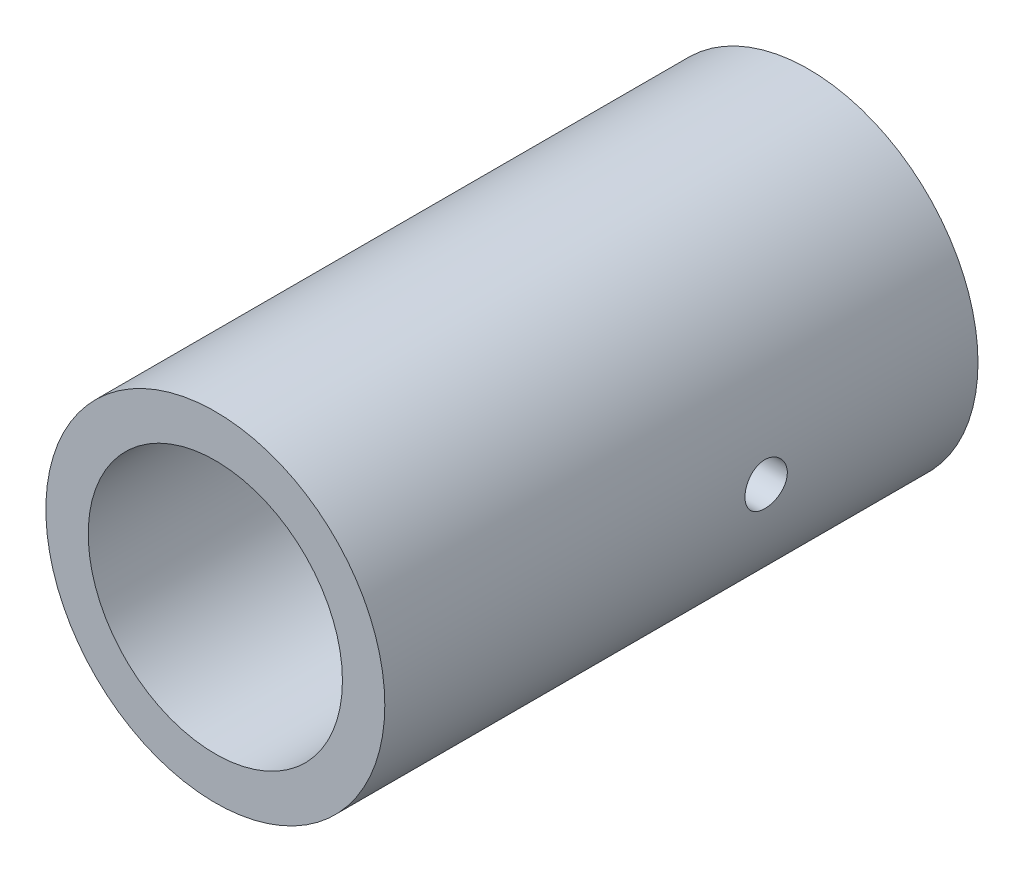
ISO-10303-21;
HEADER;
FILE_DESCRIPTION(('STEP AP214'),'2;1');
FILE_NAME('part.step','',(''),(''),'','','');
FILE_SCHEMA(('AUTOMOTIVE_DESIGN { 1 0 10303 214 1 1 1 1 }'));
ENDSEC;
DATA;
#1=APPLICATION_CONTEXT('core data for automotive mechanical design processes');
#2=APPLICATION_PROTOCOL_DEFINITION('international standard','automotive_design',2000,#1);
#3=PRODUCT_CONTEXT('',#1,'mechanical');
#4=PRODUCT('Part','Part','',(#3));
#5=PRODUCT_RELATED_PRODUCT_CATEGORY('part','',(#4));
#6=PRODUCT_DEFINITION_FORMATION('','',#4);
#7=PRODUCT_DEFINITION_CONTEXT('part definition',#1,'design');
#8=PRODUCT_DEFINITION('design','',#6,#7);
#9=PRODUCT_DEFINITION_SHAPE('','',#8);
#10=(LENGTH_UNIT() NAMED_UNIT(*) SI_UNIT(.MILLI.,.METRE.));
#11=(NAMED_UNIT(*) PLANE_ANGLE_UNIT() SI_UNIT($,.RADIAN.));
#12=(NAMED_UNIT(*) SI_UNIT($,.STERADIAN.) SOLID_ANGLE_UNIT());
#13=UNCERTAINTY_MEASURE_WITH_UNIT(LENGTH_MEASURE(1.E-05),#10,'distance_accuracy_value','');
#14=(GEOMETRIC_REPRESENTATION_CONTEXT(3) GLOBAL_UNCERTAINTY_ASSIGNED_CONTEXT((#13)) GLOBAL_UNIT_ASSIGNED_CONTEXT((#10,
#11,#12)) REPRESENTATION_CONTEXT('',''));
#15=CARTESIAN_POINT('',(0.,0.,0.));
#16=DIRECTION('',(0.,0.,1.));
#17=DIRECTION('',(1.,0.,0.));
#18=AXIS2_PLACEMENT_3D('',#15,#16,#17);
#19=CARTESIAN_POINT('',(0.,0.,70.));
#20=DIRECTION('',(0.,0.,-1.));
#21=DIRECTION('',(-1.,0.,0.));
#22=AXIS2_PLACEMENT_3D('',#19,#20,#21);
#23=CYLINDRICAL_SURFACE('',#22,20.);
#24=CARTESIAN_POINT('',(-20.,0.,27.5));
#25=CARTESIAN_POINT('',(-19.9999980489643,-0.139841095555761,27.4999940590643));
#26=CARTESIAN_POINT('',(-19.998517845549,-0.279769574302747,27.4882271208307));
#27=CARTESIAN_POINT('',(-19.9927554011136,-0.555732802089752,27.4414722454292));
#28=CARTESIAN_POINT('',(-19.9884702344143,-0.691763330623744,27.4064600620766));
#29=CARTESIAN_POINT('',(-19.9775806104441,-0.955895574813054,27.3142623560859));
#30=CARTESIAN_POINT('',(-19.9709777145554,-1.08400256014614,27.2570917581901));
#31=CARTESIAN_POINT('',(-19.956187008781,-1.32877947489304,27.1222327160302));
#32=CARTESIAN_POINT('',(-19.9479994708412,-1.44545136155637,27.0445477914693));
#33=CARTESIAN_POINT('',(-19.9309032130633,-1.66471281693132,26.8704080501604));
#34=CARTESIAN_POINT('',(-19.9219911469242,-1.76723036493713,26.7738628706538));
#35=CARTESIAN_POINT('',(-19.9044772600975,-1.95465279355749,26.5649371764634));
#36=CARTESIAN_POINT('',(-19.8958754552427,-2.03955677639225,26.4525558550868));
#37=CARTESIAN_POINT('',(-19.8799230561958,-2.18961016128394,26.2146800224343));
#38=CARTESIAN_POINT('',(-19.8725767717791,-2.25469209594107,26.0891426384321));
#39=CARTESIAN_POINT('',(-19.8600112845768,-2.36282307657512,25.8288129480527));
#40=CARTESIAN_POINT('',(-19.8547920011314,-2.40587295806522,25.694020992853));
#41=CARTESIAN_POINT('',(-19.8471033960361,-2.46849898002476,25.4197558044132));
#42=CARTESIAN_POINT('',(-19.8446198343674,-2.4881967147317,25.2803107422958));
#43=CARTESIAN_POINT('',(-19.8426402814279,-2.50393554955723,25.0000737365282));
#44=CARTESIAN_POINT('',(-19.8431441700151,-2.49997760100242,24.8592818472687));
#45=CARTESIAN_POINT('',(-19.8470695536975,-2.46861723644791,24.5811951727512));
#46=CARTESIAN_POINT('',(-19.8504743796033,-2.4413487629847,24.4438850137997));
#47=CARTESIAN_POINT('',(-19.8597919975763,-2.36435038318205,24.175804978781));
#48=CARTESIAN_POINT('',(-19.8657048404572,-2.31462002175191,24.045035235286));
#49=CARTESIAN_POINT('',(-19.8793911586465,-2.19396555991165,23.7933320009783));
#50=CARTESIAN_POINT('',(-19.8871697321144,-2.12298325370764,23.672426699751));
#51=CARTESIAN_POINT('',(-19.903707114306,-1.96188146945692,23.4441933055868));
#52=CARTESIAN_POINT('',(-19.9124659678566,-1.87176111608078,23.3368658340263));
#53=CARTESIAN_POINT('',(-19.9300510989042,-1.67419911075378,23.1380572892773));
#54=CARTESIAN_POINT('',(-19.9388774238689,-1.56664200784002,23.046690908234));
#55=CARTESIAN_POINT('',(-19.9555463255585,-1.33765716911393,22.8832911199695));
#56=CARTESIAN_POINT('',(-19.9633889000151,-1.21622940131826,22.811257757328));
#57=CARTESIAN_POINT('',(-19.9772115221858,-0.962861671363486,22.6885686795361));
#58=CARTESIAN_POINT('',(-19.9831909440154,-0.830918195337722,22.6379201461188));
#59=CARTESIAN_POINT('',(-19.9926078578006,-0.560307940431063,22.5595295064767));
#60=CARTESIAN_POINT('',(-19.9960454687587,-0.421641476630674,22.531786327863));
#61=CARTESIAN_POINT('',(-19.9999759641076,-0.142513163913505,22.5001425757394));
#62=CARTESIAN_POINT('',(-20.0004883614264,-0.00206949019861401,22.4960840076359));
#63=CARTESIAN_POINT('',(-19.9985633800543,0.277496036497489,22.511507734056));
#64=CARTESIAN_POINT('',(-19.9961260641821,0.416617917564699,22.5309895272516));
#65=CARTESIAN_POINT('',(-19.9885876875669,0.689124507721515,22.5928097087744));
#66=CARTESIAN_POINT('',(-19.9834954081387,0.822526570424698,22.6350727634026));
#67=CARTESIAN_POINT('',(-19.971217231002,1.0803496548584,22.7411774519129));
#68=CARTESIAN_POINT('',(-19.9640312622062,1.20477037146531,22.8050198184914));
#69=CARTESIAN_POINT('',(-19.9483182291011,1.44180452068742,22.9528531375075));
#70=CARTESIAN_POINT('',(-19.9397844404251,1.55435375994381,23.0369462898056));
#71=CARTESIAN_POINT('',(-19.9223514232566,1.76379698962631,23.2227494975342));
#72=CARTESIAN_POINT('',(-19.913452180269,1.86069035833685,23.324460252251));
#73=CARTESIAN_POINT('',(-19.8962310546258,2.03663195881801,23.5433074167571));
#74=CARTESIAN_POINT('',(-19.8879127472133,2.11557546056793,23.6605283463104));
#75=CARTESIAN_POINT('',(-19.8728541103715,2.2526528894435,23.9066582448547));
#76=CARTESIAN_POINT('',(-19.8661137493103,2.31078723372836,24.0355669794765));
#77=CARTESIAN_POINT('',(-19.8549985039299,2.40442657886653,24.3010753191476));
#78=CARTESIAN_POINT('',(-19.8506174518479,2.4399906274571,24.437653830048));
#79=CARTESIAN_POINT('',(-19.8446991590745,2.48766999386784,24.7149024837807));
#80=CARTESIAN_POINT('',(-19.8431617860878,2.49978640253576,24.855572435959));
#81=CARTESIAN_POINT('',(-19.8431087698246,2.50020653608483,25.1359689292047));
#82=CARTESIAN_POINT('',(-19.8445722475195,2.48867479769927,25.2756952483319));
#83=CARTESIAN_POINT('',(-19.850311145372,2.44247440484932,25.5512071293451));
#84=CARTESIAN_POINT('',(-19.8545865658308,2.40780574790577,25.6869926908088));
#85=CARTESIAN_POINT('',(-19.8654611577455,2.31636707368965,25.9507469567664));
#86=CARTESIAN_POINT('',(-19.8720594959278,2.25960498097093,26.0787184450218));
#87=CARTESIAN_POINT('',(-19.8868378324482,2.12560690215031,26.3233466540483));
#88=CARTESIAN_POINT('',(-19.8950178506041,2.04837065950959,26.4400032330198));
#89=CARTESIAN_POINT('',(-19.9121060475223,1.87500633126584,26.6595312253405));
#90=CARTESIAN_POINT('',(-19.9210187208403,1.77875562577496,26.762305460955));
#91=CARTESIAN_POINT('',(-19.938528315929,1.57035022696838,26.950306825168));
#92=CARTESIAN_POINT('',(-19.9471251627559,1.45819178914157,27.0355298107743));
#93=CARTESIAN_POINT('',(-19.9630705658675,1.22066562085421,27.1862853571053));
#94=CARTESIAN_POINT('',(-19.970414250783,1.09524927959617,27.2517418058993));
#95=CARTESIAN_POINT('',(-19.9829764907672,0.835182902301281,27.3605712429163));
#96=CARTESIAN_POINT('',(-19.9881973536958,0.700543080870237,27.4039682263535));
#97=CARTESIAN_POINT('',(-19.9946672032775,0.471005771967925,27.4570593381713));
#98=CARTESIAN_POINT('',(-19.9966572589545,0.377555663516921,27.4731389419821));
#99=CARTESIAN_POINT('',(-19.9993243132919,0.189417063212435,27.4946112456932));
#100=CARTESIAN_POINT('',(-20.0000013216347,0.0947285804960274,27.5000040243993));
#101=CARTESIAN_POINT('',(-20.,0.,27.5));
#102=B_SPLINE_CURVE_WITH_KNOTS('',3,(#24,#25,#26,#27,#28,#29,#30,#31,#32,#33,#34,#35,#36,#37,
#38,#39,#40,#41,#42,#43,#44,#45,#46,#47,#48,#49,#50,#51,#52,#53,#54,#55,#56,#57,#58,#59,#60,#61,
#62,#63,#64,#65,#66,#67,#68,#69,#70,#71,#72,#73,#74,#75,#76,#77,#78,#79,#80,#81,#82,#83,#84,#85,
#86,#87,#88,#89,#90,#91,#92,#93,#94,#95,#96,#97,#98,#99,#100,#101),.UNSPECIFIED.,.T.,.F.,(4,2,2,
2,2,2,2,2,2,2,2,2,2,2,2,2,2,2,2,2,2,2,2,2,2,2,2,2,2,2,2,2,2,2,2,2,2,2,4),(0.,0.419177272776247,
0.838792460943426,1.25812550818177,1.67738665591073,2.09870813201843,2.5200510780001,
2.94281250318869,3.36555789496806,3.78609225286321,4.20660969884664,4.62472696441692,
5.04285270166241,5.46213426285533,5.88143500513638,6.30363478136417,6.72583553113113,
7.14817795731605,7.5705006090378,7.99000279391921,8.40949604501928,8.82761053893396,
9.24573923078947,9.66602402928422,10.0863255137509,10.5090197150757,10.9317054422154,
11.3532807428092,11.7748364301062,12.1934690120221,12.6121016387955,13.0305842470649,
13.4490720991226,13.8703523769183,14.2917319847001,14.7147140303685,15.1372349868403,
15.4211884318763,15.7051397830044),.UNSPECIFIED.);
#103=CARTESIAN_POINT('',(-20.,0.,27.5));
#104=VERTEX_POINT('',#103);
#105=EDGE_CURVE('E70',#104,#104,#102,.T.);
#106=ORIENTED_EDGE('',*,*,#105,.T.);
#107=EDGE_LOOP('',(#106));
#108=FACE_BOUND('',#107,.T.);
#109=CARTESIAN_POINT('',(20.,0.,22.5));
#110=CARTESIAN_POINT('',(19.9999980489643,-0.139841095555761,22.5000059409357));
#111=CARTESIAN_POINT('',(19.998517845549,-0.279769574302747,22.5117728791693));
#112=CARTESIAN_POINT('',(19.9927554011136,-0.555732802089752,22.5585277545708));
#113=CARTESIAN_POINT('',(19.9884702344143,-0.691763330623744,22.5935399379234));
#114=CARTESIAN_POINT('',(19.9775806104441,-0.955895574813053,22.6857376439141));
#115=CARTESIAN_POINT('',(19.9709777145554,-1.08400256014614,22.7429082418099));
#116=CARTESIAN_POINT('',(19.956187008781,-1.32877947489303,22.8777672839698));
#117=CARTESIAN_POINT('',(19.9479994708412,-1.44545136155637,22.9554522085307));
#118=CARTESIAN_POINT('',(19.9309032130633,-1.66471281693131,23.1295919498396));
#119=CARTESIAN_POINT('',(19.9219911469242,-1.76723036493713,23.2261371293462));
#120=CARTESIAN_POINT('',(19.9044772600975,-1.95465279355749,23.4350628235366));
#121=CARTESIAN_POINT('',(19.8958754552427,-2.03955677639225,23.5474441449132));
#122=CARTESIAN_POINT('',(19.8799230561958,-2.18961016128394,23.7853199775657));
#123=CARTESIAN_POINT('',(19.8725767717791,-2.25469209594107,23.9108573615679));
#124=CARTESIAN_POINT('',(19.8600112845768,-2.36282307657512,24.1711870519474));
#125=CARTESIAN_POINT('',(19.8547920011314,-2.40587295806522,24.305979007147));
#126=CARTESIAN_POINT('',(19.8471033960361,-2.46849898002476,24.5802441955868));
#127=CARTESIAN_POINT('',(19.8446198343674,-2.4881967147317,24.7196892577042));
#128=CARTESIAN_POINT('',(19.8426402814279,-2.50393554955723,24.9999262634718));
#129=CARTESIAN_POINT('',(19.8431441700151,-2.49997760100242,25.1407181527313));
#130=CARTESIAN_POINT('',(19.8470695536975,-2.46861723644791,25.4188048272488));
#131=CARTESIAN_POINT('',(19.8504743796033,-2.4413487629847,25.5561149862003));
#132=CARTESIAN_POINT('',(19.8597919975763,-2.36435038318205,25.824195021219));
#133=CARTESIAN_POINT('',(19.8657048404572,-2.31462002175191,25.954964764714));
#134=CARTESIAN_POINT('',(19.8793911586465,-2.19396555991165,26.2066679990217));
#135=CARTESIAN_POINT('',(19.8871697321144,-2.12298325370764,26.327573300249));
#136=CARTESIAN_POINT('',(19.903707114306,-1.96188146945692,26.5558066944132));
#137=CARTESIAN_POINT('',(19.9124659678566,-1.87176111608078,26.6631341659737));
#138=CARTESIAN_POINT('',(19.9300510989042,-1.67419911075378,26.8619427107227));
#139=CARTESIAN_POINT('',(19.9388774238689,-1.56664200784002,26.953309091766));
#140=CARTESIAN_POINT('',(19.9555463255585,-1.33765716911393,27.1167088800305));
#141=CARTESIAN_POINT('',(19.963388900015,-1.21622940131826,27.188742242672));
#142=CARTESIAN_POINT('',(19.9772115221858,-0.96286167136349,27.3114313204639));
#143=CARTESIAN_POINT('',(19.9831909440154,-0.830918195337726,27.3620798538812));
#144=CARTESIAN_POINT('',(19.9926078578006,-0.560307940431066,27.4404704935233));
#145=CARTESIAN_POINT('',(19.9960454687587,-0.421641476630676,27.4682136721371));
#146=CARTESIAN_POINT('',(19.9999759641076,-0.142513163913506,27.4998574242606));
#147=CARTESIAN_POINT('',(20.0004883614264,-0.0020694901986158,27.5039159923641));
#148=CARTESIAN_POINT('',(19.9985633800543,0.277496036497488,27.488492265944));
#149=CARTESIAN_POINT('',(19.9961260641821,0.416617917564699,27.4690104727484));
#150=CARTESIAN_POINT('',(19.9885876875669,0.689124507721515,27.4071902912256));
#151=CARTESIAN_POINT('',(19.9834954081387,0.822526570424698,27.3649272365974));
#152=CARTESIAN_POINT('',(19.971217231002,1.0803496548584,27.2588225480871));
#153=CARTESIAN_POINT('',(19.9640312622062,1.20477037146531,27.1949801815086));
#154=CARTESIAN_POINT('',(19.9483182291011,1.44180452068742,27.0471468624925));
#155=CARTESIAN_POINT('',(19.9397844404251,1.55435375994381,26.9630537101944));
#156=CARTESIAN_POINT('',(19.9223514232566,1.76379698962631,26.7772505024658));
#157=CARTESIAN_POINT('',(19.913452180269,1.86069035833685,26.675539747749));
#158=CARTESIAN_POINT('',(19.8962310546258,2.03663195881801,26.4566925832429));
#159=CARTESIAN_POINT('',(19.8879127472133,2.11557546056793,26.3394716536896));
#160=CARTESIAN_POINT('',(19.8728541103715,2.2526528894435,26.0933417551453));
#161=CARTESIAN_POINT('',(19.8661137493103,2.31078723372836,25.9644330205235));
#162=CARTESIAN_POINT('',(19.8549985039299,2.40442657886653,25.6989246808524));
#163=CARTESIAN_POINT('',(19.8506174518479,2.4399906274571,25.562346169952));
#164=CARTESIAN_POINT('',(19.8446991590745,2.48766999386784,25.2850975162193));
#165=CARTESIAN_POINT('',(19.8431617860878,2.49978640253576,25.144427564041));
#166=CARTESIAN_POINT('',(19.8431087698246,2.50020653608483,24.8640310707953));
#167=CARTESIAN_POINT('',(19.8445722475195,2.48867479769927,24.7243047516681));
#168=CARTESIAN_POINT('',(19.850311145372,2.44247440484932,24.4487928706549));
#169=CARTESIAN_POINT('',(19.8545865658308,2.40780574790577,24.3130073091912));
#170=CARTESIAN_POINT('',(19.8654611577455,2.31636707368965,24.0492530432336));
#171=CARTESIAN_POINT('',(19.8720594959278,2.25960498097093,23.9212815549782));
#172=CARTESIAN_POINT('',(19.8868378324482,2.12560690215031,23.6766533459517));
#173=CARTESIAN_POINT('',(19.8950178506041,2.04837065950959,23.5599967669802));
#174=CARTESIAN_POINT('',(19.9121060475223,1.87500633126584,23.3404687746595));
#175=CARTESIAN_POINT('',(19.9210187208403,1.77875562577496,23.237694539045));
#176=CARTESIAN_POINT('',(19.938528315929,1.57035022696838,23.049693174832));
#177=CARTESIAN_POINT('',(19.9471251627559,1.45819178914157,22.9644701892257));
#178=CARTESIAN_POINT('',(19.9630705658675,1.22066562085421,22.8137146428947));
#179=CARTESIAN_POINT('',(19.970414250783,1.09524927959617,22.7482581941007));
#180=CARTESIAN_POINT('',(19.9829764907672,0.835182902301281,22.6394287570837));
#181=CARTESIAN_POINT('',(19.9881973536958,0.700543080870237,22.5960317736465));
#182=CARTESIAN_POINT('',(19.9946672032775,0.471005771967926,22.5429406618287));
#183=CARTESIAN_POINT('',(19.9966572589545,0.377555663516922,22.5268610580179));
#184=CARTESIAN_POINT('',(19.9993243132919,0.189417063212436,22.5053887543068));
#185=CARTESIAN_POINT('',(20.0000013216347,0.0947285804960277,22.4999959756007));
#186=CARTESIAN_POINT('',(20.,0.,22.5));
#187=B_SPLINE_CURVE_WITH_KNOTS('',3,(#109,#110,#111,#112,#113,#114,#115,#116,#117,#118,#119,
#120,#121,#122,#123,#124,#125,#126,#127,#128,#129,#130,#131,#132,#133,#134,#135,#136,#137,#138,
#139,#140,#141,#142,#143,#144,#145,#146,#147,#148,#149,#150,#151,#152,#153,#154,#155,#156,#157,
#158,#159,#160,#161,#162,#163,#164,#165,#166,#167,#168,#169,#170,#171,#172,#173,#174,#175,#176,
#177,#178,#179,#180,#181,#182,#183,#184,#185,#186),.UNSPECIFIED.,.T.,.F.,(4,2,2,2,2,2,2,2,2,2,2,
2,2,2,2,2,2,2,2,2,2,2,2,2,2,2,2,2,2,2,2,2,2,2,2,2,2,2,4),(0.,0.419177272776247,
0.838792460943426,1.25812550818177,1.67738665591073,2.09870813201843,2.5200510780001,
2.94281250318869,3.36555789496806,3.7860922528632,4.20660969884664,4.62472696441692,
5.04285270166241,5.46213426285533,5.88143500513638,6.30363478136416,6.72583553113113,
7.14817795731604,7.5705006090378,7.99000279391921,8.40949604501928,8.82761053893396,
9.24573923078947,9.66602402928421,10.0863255137509,10.5090197150757,10.9317054422154,
11.3532807428092,11.7748364301062,12.1934690120221,12.6121016387955,13.0305842470649,
13.4490720991226,13.8703523769183,14.2917319847001,14.7147140303685,15.1372349868403,
15.4211884318763,15.7051397830044),.UNSPECIFIED.);
#188=CARTESIAN_POINT('',(20.,0.,22.5));
#189=VERTEX_POINT('',#188);
#190=EDGE_CURVE('E74',#189,#189,#187,.T.);
#191=ORIENTED_EDGE('',*,*,#190,.T.);
#192=EDGE_LOOP('',(#191));
#193=FACE_BOUND('',#192,.T.);
#194=CARTESIAN_POINT('',(0.,0.,70.));
#195=DIRECTION('',(0.,0.,1.));
#196=DIRECTION('',(1.,0.,0.));
#197=AXIS2_PLACEMENT_3D('',#194,#195,#196);
#198=CIRCLE('',#197,20.);
#199=CARTESIAN_POINT('',(20.,0.,70.));
#200=VERTEX_POINT('',#199);
#201=EDGE_CURVE('E10',#200,#200,#198,.T.);
#202=ORIENTED_EDGE('',*,*,#201,.F.);
#203=EDGE_LOOP('',(#202));
#204=FACE_BOUND('',#203,.T.);
#205=CARTESIAN_POINT('',(0.,0.,0.));
#206=DIRECTION('',(0.,0.,1.));
#207=DIRECTION('',(1.,0.,0.));
#208=AXIS2_PLACEMENT_3D('',#205,#206,#207);
#209=CIRCLE('',#208,20.);
#210=CARTESIAN_POINT('',(20.,0.,0.));
#211=VERTEX_POINT('',#210);
#212=EDGE_CURVE('E43',#211,#211,#209,.T.);
#213=ORIENTED_EDGE('',*,*,#212,.T.);
#214=EDGE_LOOP('',(#213));
#215=FACE_BOUND('',#214,.T.);
#216=ADVANCED_FACE('F31',(#108,#193,#204,#215),#23,.T.);
#217=CARTESIAN_POINT('',(0.,0.,70.));
#218=DIRECTION('',(0.,0.,1.));
#219=DIRECTION('',(1.,0.,0.));
#220=AXIS2_PLACEMENT_3D('',#217,#218,#219);
#221=PLANE('',#220);
#222=CARTESIAN_POINT('',(0.,0.,70.));
#223=DIRECTION('',(0.,0.,1.));
#224=DIRECTION('',(1.,0.,0.));
#225=AXIS2_PLACEMENT_3D('',#222,#223,#224);
#226=CIRCLE('',#225,15.);
#227=CARTESIAN_POINT('',(15.,0.,70.));
#228=VERTEX_POINT('',#227);
#229=EDGE_CURVE('E51',#228,#228,#226,.T.);
#230=ORIENTED_EDGE('',*,*,#229,.F.);
#231=EDGE_LOOP('',(#230));
#232=FACE_BOUND('',#231,.T.);
#233=ORIENTED_EDGE('',*,*,#201,.T.);
#234=EDGE_LOOP('',(#233));
#235=FACE_BOUND('',#234,.T.);
#236=ADVANCED_FACE('F85',(#232,#235),#221,.T.);
#237=CARTESIAN_POINT('',(0.,0.,0.));
#238=DIRECTION('',(0.,0.,1.));
#239=DIRECTION('',(1.,0.,0.));
#240=AXIS2_PLACEMENT_3D('',#237,#238,#239);
#241=PLANE('',#240);
#242=CARTESIAN_POINT('',(0.,0.,0.));
#243=DIRECTION('',(0.,0.,1.));
#244=DIRECTION('',(1.,0.,0.));
#245=AXIS2_PLACEMENT_3D('',#242,#243,#244);
#246=CIRCLE('',#245,15.);
#247=CARTESIAN_POINT('',(15.,0.,0.));
#248=VERTEX_POINT('',#247);
#249=EDGE_CURVE('E48',#248,#248,#246,.T.);
#250=ORIENTED_EDGE('',*,*,#249,.T.);
#251=EDGE_LOOP('',(#250));
#252=FACE_BOUND('',#251,.T.);
#253=ORIENTED_EDGE('',*,*,#212,.F.);
#254=EDGE_LOOP('',(#253));
#255=FACE_BOUND('',#254,.T.);
#256=ADVANCED_FACE('F87',(#252,#255),#241,.F.);
#257=CARTESIAN_POINT('',(0.,0.,0.));
#258=DIRECTION('',(0.,0.,1.));
#259=DIRECTION('',(1.,0.,0.));
#260=AXIS2_PLACEMENT_3D('',#257,#258,#259);
#261=CYLINDRICAL_SURFACE('',#260,15.);
#262=CARTESIAN_POINT('',(15.,0.,22.5));
#263=CARTESIAN_POINT('',(14.9999976116882,0.139390904958215,22.5000055889478));
#264=CARTESIAN_POINT('',(14.9980367791303,0.278857881838821,22.5116972749689));
#265=CARTESIAN_POINT('',(14.9904034494139,0.553880221673042,22.5581356587653));
#266=CARTESIAN_POINT('',(14.9847275392389,0.689431867959246,22.5929035569116));
#267=CARTESIAN_POINT('',(14.9703006823645,0.952604747212643,22.6844154485928));
#268=CARTESIAN_POINT('',(14.9615522515919,1.0802323684319,22.7411414656406));
#269=CARTESIAN_POINT('',(14.9419422708207,1.32414184197794,22.8749122920524));
#270=CARTESIAN_POINT('',(14.9310809625443,1.44042498987859,22.951954777483));
#271=CARTESIAN_POINT('',(14.9083331745831,1.65947261429168,23.1249550838205));
#272=CARTESIAN_POINT('',(14.8964387181486,1.76211290353497,23.2210691146361));
#273=CARTESIAN_POINT('',(14.8730262687673,1.94988849865993,23.4291479684728));
#274=CARTESIAN_POINT('',(14.8615082996267,2.03502269939097,23.5411137914566));
#275=CARTESIAN_POINT('',(14.8400756575978,2.18586712560513,23.7785709661971));
#276=CARTESIAN_POINT('',(14.8301712909164,2.251454552861,23.9041413368048));
#277=CARTESIAN_POINT('',(14.8131978979467,2.36055836541122,24.1647095643006));
#278=CARTESIAN_POINT('',(14.8061286801431,2.40407624156561,24.2997067836776));
#279=CARTESIAN_POINT('',(14.7957053684276,2.4674143777848,24.5739802748565));
#280=CARTESIAN_POINT('',(14.792317684857,2.4874490291354,24.7132057365014));
#281=CARTESIAN_POINT('',(14.7895393893665,2.50391672528987,24.9930802768835));
#282=CARTESIAN_POINT('',(14.7901484945721,2.50035144038899,25.1337292541673));
#283=CARTESIAN_POINT('',(14.7952642886356,2.46989509839615,25.4109278612755));
#284=CARTESIAN_POINT('',(14.7997307331892,2.44324488188977,25.5475048035452));
#285=CARTESIAN_POINT('',(14.8119949521101,2.36775314040344,25.8142213178291));
#286=CARTESIAN_POINT('',(14.8197928407327,2.31891085431973,25.9443606688886));
#287=CARTESIAN_POINT('',(14.837884793341,2.2001772460939,26.1952288234409));
#288=CARTESIAN_POINT('',(14.8481906710733,2.13018591387971,26.3159094060812));
#289=CARTESIAN_POINT('',(14.8701291841501,1.97121201755743,26.5439044005384));
#290=CARTESIAN_POINT('',(14.8817619265429,1.88222792065428,26.6512177324549));
#291=CARTESIAN_POINT('',(14.9052202787979,1.68648221215905,26.8508260858073));
#292=CARTESIAN_POINT('',(14.9170464923165,1.57951396387312,26.9429185185401));
#293=CARTESIAN_POINT('',(14.9394260139672,1.35153524898164,27.1078777626653));
#294=CARTESIAN_POINT('',(14.9499793138975,1.23052469190642,27.1807444501832));
#295=CARTESIAN_POINT('',(14.9686389289291,0.977705916166704,27.3052022271363));
#296=CARTESIAN_POINT('',(14.9767431840745,0.845888725564654,27.3567754193313));
#297=CARTESIAN_POINT('',(14.9895750301266,0.575298345602724,27.436994215246));
#298=CARTESIAN_POINT('',(14.9943029035047,0.43652573917946,27.4656417369737));
#299=CARTESIAN_POINT('',(14.9998112984269,0.157709901301616,27.4989213584611));
#300=CARTESIAN_POINT('',(15.0006375301278,0.0177007371510034,27.5038315718056));
#301=CARTESIAN_POINT('',(14.9983747442117,-0.261139772889895,27.4902386555719));
#302=CARTESIAN_POINT('',(14.9952858772412,-0.399971163892045,27.4717364268663));
#303=CARTESIAN_POINT('',(14.985568269382,-0.67165617554677,27.4120751506645));
#304=CARTESIAN_POINT('',(14.9789610480131,-0.804540868385385,27.3710537916099));
#305=CARTESIAN_POINT('',(14.9629446445536,-1.06154688486045,27.2676654818005));
#306=CARTESIAN_POINT('',(14.9535353051202,-1.18566771590972,27.2052973323647));
#307=CARTESIAN_POINT('',(14.9328451630241,-1.42283068946896,27.0603488753032));
#308=CARTESIAN_POINT('',(14.9215485588702,-1.53576525093715,26.9775948438327));
#309=CARTESIAN_POINT('',(14.898384673919,-1.74624358550269,26.7944626846149));
#310=CARTESIAN_POINT('',(14.8865173517155,-1.84378623969659,26.6940832767233));
#311=CARTESIAN_POINT('',(14.8634017523585,-2.02174277965801,26.4773024519286));
#312=CARTESIAN_POINT('',(14.8521611613711,-2.10196876111372,26.3607458344856));
#313=CARTESIAN_POINT('',(14.8317152977788,-2.24170231029499,26.1156470308615));
#314=CARTESIAN_POINT('',(14.8225099606602,-2.30121053476983,25.9871052247725));
#315=CARTESIAN_POINT('',(14.807234536977,-2.39753833147315,25.7222102671879));
#316=CARTESIAN_POINT('',(14.8011515431106,-2.43445143254795,25.5858919049695));
#317=CARTESIAN_POINT('',(14.7927771683526,-2.48483545377828,25.3088798707782));
#318=CARTESIAN_POINT('',(14.7904854578272,-2.49830841194617,25.1681865802679));
#319=CARTESIAN_POINT('',(14.7899673308401,-2.50137286604735,24.8882948340376));
#320=CARTESIAN_POINT('',(14.7916905650565,-2.49126013612519,24.7490996214247));
#321=CARTESIAN_POINT('',(14.7988978145373,-2.44807983895685,24.4744207519492));
#322=CARTESIAN_POINT('',(14.8043818176121,-2.41501234611248,24.3389370830581));
#323=CARTESIAN_POINT('',(14.8184735628172,-2.3269744895949,24.0756415627074));
#324=CARTESIAN_POINT('',(14.8270776721967,-2.27202959060044,23.947820989944));
#325=CARTESIAN_POINT('',(14.8464436892221,-2.14182700391591,23.7031643308052));
#326=CARTESIAN_POINT('',(14.857205703884,-2.06656830874856,23.5863287896279));
#327=CARTESIAN_POINT('',(14.8798345404562,-1.89681888437216,23.3654644168922));
#328=CARTESIAN_POINT('',(14.891712955763,-1.80211056359365,23.2616039832997));
#329=CARTESIAN_POINT('',(14.9151437236084,-1.59660903138023,23.0711483955251));
#330=CARTESIAN_POINT('',(14.9266960002655,-1.48581211291264,22.9845572313618));
#331=CARTESIAN_POINT('',(14.9482652964222,-1.25036916964028,22.8305517318001));
#332=CARTESIAN_POINT('',(14.958271162531,-1.12563278753282,22.7632739606871));
#333=CARTESIAN_POINT('',(14.9755116760178,-0.86651306937898,22.6507305153901));
#334=CARTESIAN_POINT('',(14.9827490817748,-0.732139494830008,22.6054429189203));
#335=CARTESIAN_POINT('',(14.9920579083296,-0.497703310045399,22.5479947258733));
#336=CARTESIAN_POINT('',(14.9950202727336,-0.399058830298446,22.530025530384));
#337=CARTESIAN_POINT('',(14.9989921598612,-0.200289310319808,22.5060262621553));
#338=CARTESIAN_POINT('',(15.0000017162064,-0.100164295608494,22.4999959838626));
#339=CARTESIAN_POINT('',(15.,0.,22.5));
#340=B_SPLINE_CURVE_WITH_KNOTS('',3,(#262,#263,#264,#265,#266,#267,#268,#269,#270,#271,#272,
#273,#274,#275,#276,#277,#278,#279,#280,#281,#282,#283,#284,#285,#286,#287,#288,#289,#290,#291,
#292,#293,#294,#295,#296,#297,#298,#299,#300,#301,#302,#303,#304,#305,#306,#307,#308,#309,#310,
#311,#312,#313,#314,#315,#316,#317,#318,#319,#320,#321,#322,#323,#324,#325,#326,#327,#328,#329,
#330,#331,#332,#333,#334,#335,#336,#337,#338,#339),.UNSPECIFIED.,.T.,.F.,(4,2,2,2,2,2,2,2,2,2,2,
2,2,2,2,2,2,2,2,2,2,2,2,2,2,2,2,2,2,2,2,2,2,2,2,2,2,2,4),(0.,0.417806584938509,0.83599754569542,
1.25384686702527,1.67164841267479,2.09302491062332,2.51442800169857,2.9384252082384,
3.36239376876181,3.78246077103423,4.20249804320886,4.61820521760408,5.03392665025381,
5.45164556632558,5.86939820680573,6.29232769911326,6.71525991635847,7.13854688915903,
7.56179844521149,7.98007883491397,8.39834313035859,8.81407807006415,9.22983635826066,
9.64926825627023,10.0687306305428,10.4925382200762,10.9163323737594,11.3383602234177,
11.7603513778662,12.177079095227,12.5938054618813,13.0100481822622,13.4263115502934,
13.8475138419339,14.2688133387897,14.693022316072,15.1168075213007,15.4170424816402,
15.7172722727697),.UNSPECIFIED.);
#341=CARTESIAN_POINT('',(15.,0.,22.5));
#342=VERTEX_POINT('',#341);
#343=EDGE_CURVE('E35',#342,#342,#340,.T.);
#344=ORIENTED_EDGE('',*,*,#343,.T.);
#345=EDGE_LOOP('',(#344));
#346=FACE_BOUND('',#345,.T.);
#347=CARTESIAN_POINT('',(-15.,0.,22.5));
#348=CARTESIAN_POINT('',(-14.9999976116882,-0.139390904958218,22.5000055889478));
#349=CARTESIAN_POINT('',(-14.9980367791303,-0.278857881838824,22.5116972749689));
#350=CARTESIAN_POINT('',(-14.9904034494139,-0.553880221673046,22.5581356587653));
#351=CARTESIAN_POINT('',(-14.9847275392389,-0.68943186795925,22.5929035569116));
#352=CARTESIAN_POINT('',(-14.9703006823645,-0.952604747212647,22.6844154485928));
#353=CARTESIAN_POINT('',(-14.9615522515919,-1.0802323684319,22.7411414656406));
#354=CARTESIAN_POINT('',(-14.9419422708207,-1.32414184197795,22.8749122920524));
#355=CARTESIAN_POINT('',(-14.9310809625443,-1.44042498987859,22.951954777483));
#356=CARTESIAN_POINT('',(-14.9083331745831,-1.65947261429168,23.1249550838205));
#357=CARTESIAN_POINT('',(-14.8964387181486,-1.76211290353497,23.2210691146361));
#358=CARTESIAN_POINT('',(-14.8730262687673,-1.94988849865993,23.4291479684728));
#359=CARTESIAN_POINT('',(-14.8615082996267,-2.03502269939097,23.5411137914566));
#360=CARTESIAN_POINT('',(-14.8400756575978,-2.18586712560514,23.7785709661971));
#361=CARTESIAN_POINT('',(-14.8301712909164,-2.251454552861,23.9041413368048));
#362=CARTESIAN_POINT('',(-14.8131978979467,-2.36055836541122,24.1647095643006));
#363=CARTESIAN_POINT('',(-14.8061286801431,-2.40407624156561,24.2997067836776));
#364=CARTESIAN_POINT('',(-14.7957053684276,-2.46741437778481,24.5739802748565));
#365=CARTESIAN_POINT('',(-14.792317684857,-2.4874490291354,24.7132057365014));
#366=CARTESIAN_POINT('',(-14.7895393893665,-2.50391672528988,24.9930802768835));
#367=CARTESIAN_POINT('',(-14.7901484945721,-2.500351440389,25.1337292541673));
#368=CARTESIAN_POINT('',(-14.7952642886356,-2.46989509839615,25.4109278612755));
#369=CARTESIAN_POINT('',(-14.7997307331892,-2.44324488188977,25.5475048035452));
#370=CARTESIAN_POINT('',(-14.8119949521101,-2.36775314040345,25.8142213178291));
#371=CARTESIAN_POINT('',(-14.8197928407327,-2.31891085431974,25.9443606688885));
#372=CARTESIAN_POINT('',(-14.837884793341,-2.20017724609391,26.1952288234409));
#373=CARTESIAN_POINT('',(-14.8481906710733,-2.13018591387972,26.3159094060812));
#374=CARTESIAN_POINT('',(-14.8701291841501,-1.97121201755743,26.5439044005384));
#375=CARTESIAN_POINT('',(-14.8817619265429,-1.88222792065429,26.6512177324549));
#376=CARTESIAN_POINT('',(-14.9052202787979,-1.68648221215905,26.8508260858073));
#377=CARTESIAN_POINT('',(-14.9170464923165,-1.57951396387313,26.9429185185401));
#378=CARTESIAN_POINT('',(-14.9394260139672,-1.35153524898165,27.1078777626653));
#379=CARTESIAN_POINT('',(-14.9499793138975,-1.23052469190642,27.1807444501832));
#380=CARTESIAN_POINT('',(-14.9686389289291,-0.977705916166712,27.3052022271363));
#381=CARTESIAN_POINT('',(-14.9767431840745,-0.845888725564663,27.3567754193313));
#382=CARTESIAN_POINT('',(-14.9895750301266,-0.575298345602734,27.436994215246));
#383=CARTESIAN_POINT('',(-14.9943029035047,-0.43652573917947,27.4656417369737));
#384=CARTESIAN_POINT('',(-14.9998112984269,-0.157709901301625,27.4989213584611));
#385=CARTESIAN_POINT('',(-15.0006375301278,-0.0177007371510128,27.5038315718056));
#386=CARTESIAN_POINT('',(-14.9983747442117,0.261139772889885,27.4902386555719));
#387=CARTESIAN_POINT('',(-14.9952858772412,0.399971163892036,27.4717364268663));
#388=CARTESIAN_POINT('',(-14.985568269382,0.67165617554676,27.4120751506645));
#389=CARTESIAN_POINT('',(-14.9789610480131,0.804540868385376,27.3710537916099));
#390=CARTESIAN_POINT('',(-14.9629446445536,1.06154688486044,27.2676654818005));
#391=CARTESIAN_POINT('',(-14.9535353051202,1.18566771590972,27.2052973323647));
#392=CARTESIAN_POINT('',(-14.9328451630241,1.42283068946896,27.0603488753032));
#393=CARTESIAN_POINT('',(-14.9215485588702,1.53576525093715,26.9775948438327));
#394=CARTESIAN_POINT('',(-14.898384673919,1.74624358550269,26.7944626846149));
#395=CARTESIAN_POINT('',(-14.8865173517155,1.84378623969658,26.6940832767233));
#396=CARTESIAN_POINT('',(-14.8634017523585,2.021742779658,26.4773024519286));
#397=CARTESIAN_POINT('',(-14.8521611613711,2.10196876111371,26.3607458344856));
#398=CARTESIAN_POINT('',(-14.8317152977788,2.24170231029498,26.1156470308615));
#399=CARTESIAN_POINT('',(-14.8225099606602,2.30121053476982,25.9871052247725));
#400=CARTESIAN_POINT('',(-14.807234536977,2.39753833147314,25.7222102671879));
#401=CARTESIAN_POINT('',(-14.8011515431106,2.43445143254794,25.5858919049695));
#402=CARTESIAN_POINT('',(-14.7927771683526,2.48483545377827,25.3088798707782));
#403=CARTESIAN_POINT('',(-14.7904854578272,2.49830841194616,25.1681865802679));
#404=CARTESIAN_POINT('',(-14.7899673308401,2.50137286604735,24.8882948340376));
#405=CARTESIAN_POINT('',(-14.7916905650565,2.49126013612518,24.7490996214247));
#406=CARTESIAN_POINT('',(-14.7988978145373,2.44807983895684,24.4744207519492));
#407=CARTESIAN_POINT('',(-14.8043818176121,2.41501234611247,24.3389370830581));
#408=CARTESIAN_POINT('',(-14.8184735628172,2.3269744895949,24.0756415627074));
#409=CARTESIAN_POINT('',(-14.8270776721967,2.27202959060044,23.947820989944));
#410=CARTESIAN_POINT('',(-14.8464436892221,2.14182700391591,23.7031643308052));
#411=CARTESIAN_POINT('',(-14.857205703884,2.06656830874856,23.5863287896279));
#412=CARTESIAN_POINT('',(-14.8798345404562,1.89681888437215,23.3654644168922));
#413=CARTESIAN_POINT('',(-14.891712955763,1.80211056359364,23.2616039832997));
#414=CARTESIAN_POINT('',(-14.9151437236084,1.59660903138023,23.0711483955251));
#415=CARTESIAN_POINT('',(-14.9266960002655,1.48581211291263,22.9845572313618));
#416=CARTESIAN_POINT('',(-14.9482652964222,1.25036916964028,22.8305517318001));
#417=CARTESIAN_POINT('',(-14.958271162531,1.12563278753282,22.7632739606871));
#418=CARTESIAN_POINT('',(-14.9755116760178,0.866513069378979,22.6507305153901));
#419=CARTESIAN_POINT('',(-14.9827490817748,0.732139494830008,22.6054429189203));
#420=CARTESIAN_POINT('',(-14.9920579083296,0.497703310045398,22.5479947258733));
#421=CARTESIAN_POINT('',(-14.9950202727336,0.399058830298445,22.530025530384));
#422=CARTESIAN_POINT('',(-14.9989921598612,0.200289310319806,22.5060262621552));
#423=CARTESIAN_POINT('',(-15.0000017162064,0.100164295608491,22.4999959838626));
#424=CARTESIAN_POINT('',(-15.,0.,22.5));
#425=B_SPLINE_CURVE_WITH_KNOTS('',3,(#347,#348,#349,#350,#351,#352,#353,#354,#355,#356,#357,
#358,#359,#360,#361,#362,#363,#364,#365,#366,#367,#368,#369,#370,#371,#372,#373,#374,#375,#376,
#377,#378,#379,#380,#381,#382,#383,#384,#385,#386,#387,#388,#389,#390,#391,#392,#393,#394,#395,
#396,#397,#398,#399,#400,#401,#402,#403,#404,#405,#406,#407,#408,#409,#410,#411,#412,#413,#414,
#415,#416,#417,#418,#419,#420,#421,#422,#423,#424),.UNSPECIFIED.,.T.,.F.,(4,2,2,2,2,2,2,2,2,2,2,
2,2,2,2,2,2,2,2,2,2,2,2,2,2,2,2,2,2,2,2,2,2,2,2,2,2,2,4),(0.,0.417806584938509,0.83599754569542,
1.25384686702527,1.67164841267479,2.09302491062332,2.51442800169857,2.9384252082384,
3.36239376876181,3.78246077103424,4.20249804320887,4.61820521760408,5.03392665025381,
5.45164556632557,5.86939820680574,6.29232769911327,6.71525991635847,7.13854688915903,
7.56179844521149,7.98007883491397,8.39834313035859,8.81407807006415,9.22983635826066,
9.64926825627023,10.0687306305428,10.4925382200762,10.9163323737594,11.3383602234177,
11.7603513778662,12.177079095227,12.5938054618813,13.0100481822622,13.4263115502934,
13.8475138419339,14.2688133387897,14.693022316072,15.1168075213007,15.4170424816402,
15.7172722727697),.UNSPECIFIED.);
#426=CARTESIAN_POINT('',(-15.,0.,22.5));
#427=VERTEX_POINT('',#426);
#428=EDGE_CURVE('E53',#427,#427,#425,.T.);
#429=ORIENTED_EDGE('',*,*,#428,.T.);
#430=EDGE_LOOP('',(#429));
#431=FACE_BOUND('',#430,.T.);
#432=ORIENTED_EDGE('',*,*,#249,.F.);
#433=EDGE_LOOP('',(#432));
#434=FACE_BOUND('',#433,.T.);
#435=ORIENTED_EDGE('',*,*,#229,.T.);
#436=EDGE_LOOP('',(#435));
#437=FACE_BOUND('',#436,.T.);
#438=ADVANCED_FACE('F57',(#346,#431,#434,#437),#261,.F.);
#439=CARTESIAN_POINT('',(-33.,0.,25.));
#440=DIRECTION('',(1.,0.,0.));
#441=DIRECTION('',(0.,0.,-1.));
#442=AXIS2_PLACEMENT_3D('',#439,#440,#441);
#443=CYLINDRICAL_SURFACE('',#442,2.5);
#444=ORIENTED_EDGE('',*,*,#428,.F.);
#445=EDGE_LOOP('',(#444));
#446=FACE_BOUND('',#445,.T.);
#447=ORIENTED_EDGE('',*,*,#105,.F.);
#448=EDGE_LOOP('',(#447));
#449=FACE_BOUND('',#448,.T.);
#450=ADVANCED_FACE('F63',(#446,#449),#443,.F.);
#451=ORIENTED_EDGE('',*,*,#343,.F.);
#452=EDGE_LOOP('',(#451));
#453=FACE_BOUND('',#452,.T.);
#454=ORIENTED_EDGE('',*,*,#190,.F.);
#455=EDGE_LOOP('',(#454));
#456=FACE_BOUND('',#455,.T.);
#457=ADVANCED_FACE('F60',(#453,#456),#443,.F.);
#458=CLOSED_SHELL('',(#216,#236,#256,#438,#450,#457));
#459=MANIFOLD_SOLID_BREP('B2',#458);
#460=ADVANCED_BREP_SHAPE_REPRESENTATION('',(#18,#459),#14);
#461=SHAPE_DEFINITION_REPRESENTATION(#9,#460);
ENDSEC;
END-ISO-10303-21;
